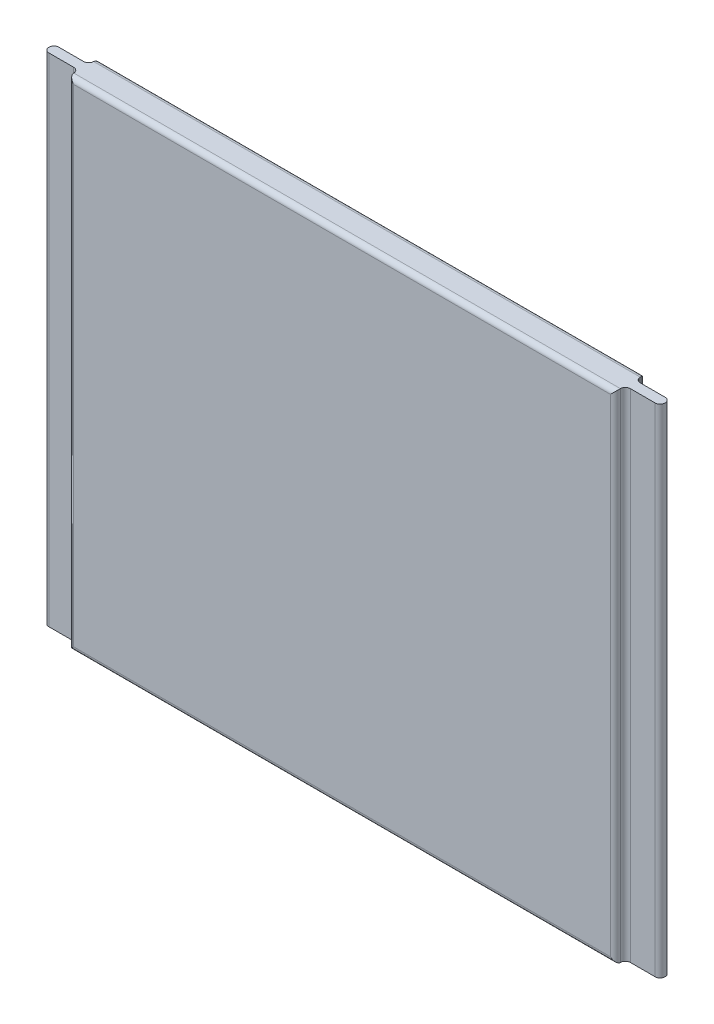
ISO-10303-21;
HEADER;
FILE_DESCRIPTION(('STEP AP214'),'2;1');
FILE_NAME('part.step','',(''),(''),'','','');
FILE_SCHEMA(('AUTOMOTIVE_DESIGN { 1 0 10303 214 1 1 1 1 }'));
ENDSEC;
DATA;
#1=APPLICATION_CONTEXT('core data for automotive mechanical design processes');
#2=APPLICATION_PROTOCOL_DEFINITION('international standard','automotive_design',2000,#1);
#3=PRODUCT_CONTEXT('',#1,'mechanical');
#4=PRODUCT('Part','Part','',(#3));
#5=PRODUCT_RELATED_PRODUCT_CATEGORY('part','',(#4));
#6=PRODUCT_DEFINITION_FORMATION('','',#4);
#7=PRODUCT_DEFINITION_CONTEXT('part definition',#1,'design');
#8=PRODUCT_DEFINITION('design','',#6,#7);
#9=PRODUCT_DEFINITION_SHAPE('','',#8);
#10=(LENGTH_UNIT() NAMED_UNIT(*) SI_UNIT(.MILLI.,.METRE.));
#11=(NAMED_UNIT(*) PLANE_ANGLE_UNIT() SI_UNIT($,.RADIAN.));
#12=(NAMED_UNIT(*) SI_UNIT($,.STERADIAN.) SOLID_ANGLE_UNIT());
#13=UNCERTAINTY_MEASURE_WITH_UNIT(LENGTH_MEASURE(1.E-05),#10,'distance_accuracy_value','');
#14=(GEOMETRIC_REPRESENTATION_CONTEXT(3) GLOBAL_UNCERTAINTY_ASSIGNED_CONTEXT((#13)) GLOBAL_UNIT_ASSIGNED_CONTEXT((#10,
#11,#12)) REPRESENTATION_CONTEXT('',''));
#15=CARTESIAN_POINT('',(0.,0.,0.));
#16=DIRECTION('',(0.,0.,1.));
#17=DIRECTION('',(1.,0.,0.));
#18=AXIS2_PLACEMENT_3D('',#15,#16,#17);
#19=CARTESIAN_POINT('',(56.,100.,2.));
#20=DIRECTION('',(0.,-1.,0.));
#21=DIRECTION('',(0.,0.,-1.));
#22=AXIS2_PLACEMENT_3D('',#19,#20,#21);
#23=CYLINDRICAL_SURFACE('',#22,1.);
#24=CARTESIAN_POINT('',(56.,0.,2.));
#25=DIRECTION('',(0.,-1.,0.));
#26=DIRECTION('',(0.,0.,-1.));
#27=AXIS2_PLACEMENT_3D('',#24,#25,#26);
#28=CIRCLE('',#27,1.);
#29=CARTESIAN_POINT('',(55.,0.,2.));
#30=VERTEX_POINT('',#29);
#31=CARTESIAN_POINT('',(56.,0.,0.999999999999996));
#32=VERTEX_POINT('',#31);
#33=EDGE_CURVE('E191',#30,#32,#28,.T.);
#34=ORIENTED_EDGE('',*,*,#33,.T.);
#35=DIRECTION('',(0.,-1.,0.));
#36=VECTOR('',#35,1.);
#37=CARTESIAN_POINT('',(56.,100.,0.999999999999996));
#38=LINE('',#37,#36);
#39=CARTESIAN_POINT('',(56.,100.,0.999999999999996));
#40=VERTEX_POINT('',#39);
#41=EDGE_CURVE('E166',#40,#32,#38,.T.);
#42=ORIENTED_EDGE('',*,*,#41,.F.);
#43=CARTESIAN_POINT('',(56.,100.,2.));
#44=DIRECTION('',(0.,-1.,0.));
#45=DIRECTION('',(0.,0.,-1.));
#46=AXIS2_PLACEMENT_3D('',#43,#44,#45);
#47=CIRCLE('',#46,1.);
#48=CARTESIAN_POINT('',(55.,100.,2.));
#49=VERTEX_POINT('',#48);
#50=EDGE_CURVE('E150',#49,#40,#47,.T.);
#51=ORIENTED_EDGE('',*,*,#50,.F.);
#52=DIRECTION('',(0.,-1.,0.));
#53=VECTOR('',#52,1.);
#54=CARTESIAN_POINT('',(55.,100.,2.));
#55=LINE('',#54,#53);
#56=EDGE_CURVE('E163',#49,#30,#55,.T.);
#57=ORIENTED_EDGE('',*,*,#56,.T.);
#58=EDGE_LOOP('',(#34,#42,#51,#57));
#59=FACE_BOUND('',#58,.T.);
#60=ADVANCED_FACE('F33',(#59),#23,.F.);
#61=CARTESIAN_POINT('',(56.,100.,0.999999999999996));
#62=DIRECTION('',(0.,0.,-1.));
#63=DIRECTION('',(-1.,0.,0.));
#64=AXIS2_PLACEMENT_3D('',#61,#62,#63);
#65=PLANE('',#64);
#66=DIRECTION('',(1.,0.,0.));
#67=VECTOR('',#66,1.);
#68=CARTESIAN_POINT('',(56.,0.,0.999999999999996));
#69=LINE('',#68,#67);
#70=CARTESIAN_POINT('',(61.,0.,1.00000000000001));
#71=VERTEX_POINT('',#70);
#72=EDGE_CURVE('E259',#32,#71,#69,.T.);
#73=ORIENTED_EDGE('',*,*,#72,.T.);
#74=DIRECTION('',(0.,-1.,0.));
#75=VECTOR('',#74,1.);
#76=CARTESIAN_POINT('',(61.,100.,1.00000000000001));
#77=LINE('',#76,#75);
#78=CARTESIAN_POINT('',(61.,100.,1.00000000000001));
#79=VERTEX_POINT('',#78);
#80=EDGE_CURVE('E213',#79,#71,#77,.T.);
#81=ORIENTED_EDGE('',*,*,#80,.F.);
#82=DIRECTION('',(1.,0.,0.));
#83=VECTOR('',#82,1.);
#84=CARTESIAN_POINT('',(56.,100.,0.999999999999996));
#85=LINE('',#84,#83);
#86=EDGE_CURVE('E168',#40,#79,#85,.T.);
#87=ORIENTED_EDGE('',*,*,#86,.F.);
#88=ORIENTED_EDGE('',*,*,#41,.T.);
#89=EDGE_LOOP('',(#73,#81,#87,#88));
#90=FACE_BOUND('',#89,.T.);
#91=ADVANCED_FACE('F281',(#90),#65,.F.);
#92=CARTESIAN_POINT('',(61.,100.,0.));
#93=DIRECTION('',(0.,-1.,0.));
#94=DIRECTION('',(0.,0.,-1.));
#95=AXIS2_PLACEMENT_3D('',#92,#93,#94);
#96=CYLINDRICAL_SURFACE('',#95,1.);
#97=CARTESIAN_POINT('',(61.,0.,0.));
#98=DIRECTION('',(0.,1.,0.));
#99=DIRECTION('',(0.,0.,-1.));
#100=AXIS2_PLACEMENT_3D('',#97,#98,#99);
#101=CIRCLE('',#100,1.);
#102=CARTESIAN_POINT('',(61.,0.,-1.));
#103=VERTEX_POINT('',#102);
#104=EDGE_CURVE('E257',#71,#103,#101,.T.);
#105=ORIENTED_EDGE('',*,*,#104,.T.);
#106=DIRECTION('',(0.,-1.,0.));
#107=VECTOR('',#106,1.);
#108=CARTESIAN_POINT('',(61.,100.,-1.));
#109=LINE('',#108,#107);
#110=CARTESIAN_POINT('',(61.,100.,-1.));
#111=VERTEX_POINT('',#110);
#112=EDGE_CURVE('E216',#111,#103,#109,.T.);
#113=ORIENTED_EDGE('',*,*,#112,.F.);
#114=CARTESIAN_POINT('',(61.,100.,0.));
#115=DIRECTION('',(0.,1.,0.));
#116=DIRECTION('',(0.,0.,-1.));
#117=AXIS2_PLACEMENT_3D('',#114,#115,#116);
#118=CIRCLE('',#117,1.);
#119=EDGE_CURVE('E275',#79,#111,#118,.T.);
#120=ORIENTED_EDGE('',*,*,#119,.F.);
#121=ORIENTED_EDGE('',*,*,#80,.T.);
#122=EDGE_LOOP('',(#105,#113,#120,#121));
#123=FACE_BOUND('',#122,.T.);
#124=ADVANCED_FACE('F285',(#123),#96,.T.);
#125=CARTESIAN_POINT('',(56.,100.,-1.));
#126=DIRECTION('',(0.,0.,1.));
#127=DIRECTION('',(1.,0.,0.));
#128=AXIS2_PLACEMENT_3D('',#125,#126,#127);
#129=PLANE('',#128);
#130=DIRECTION('',(-1.,0.,0.));
#131=VECTOR('',#130,1.);
#132=CARTESIAN_POINT('',(56.,0.,-1.));
#133=LINE('',#132,#131);
#134=CARTESIAN_POINT('',(56.,0.,-1.));
#135=VERTEX_POINT('',#134);
#136=EDGE_CURVE('E255',#103,#135,#133,.T.);
#137=ORIENTED_EDGE('',*,*,#136,.T.);
#138=DIRECTION('',(0.,-1.,0.));
#139=VECTOR('',#138,1.);
#140=CARTESIAN_POINT('',(56.,100.,-1.));
#141=LINE('',#140,#139);
#142=CARTESIAN_POINT('',(56.,100.,-1.));
#143=VERTEX_POINT('',#142);
#144=EDGE_CURVE('E219',#143,#135,#141,.T.);
#145=ORIENTED_EDGE('',*,*,#144,.F.);
#146=DIRECTION('',(-1.,0.,0.));
#147=VECTOR('',#146,1.);
#148=CARTESIAN_POINT('',(56.,100.,-1.));
#149=LINE('',#148,#147);
#150=EDGE_CURVE('E273',#111,#143,#149,.T.);
#151=ORIENTED_EDGE('',*,*,#150,.F.);
#152=ORIENTED_EDGE('',*,*,#112,.T.);
#153=EDGE_LOOP('',(#137,#145,#151,#152));
#154=FACE_BOUND('',#153,.T.);
#155=ADVANCED_FACE('F290',(#154),#129,.F.);
#156=CARTESIAN_POINT('',(56.,100.,-2.));
#157=DIRECTION('',(0.,-1.,0.));
#158=DIRECTION('',(0.,0.,-1.));
#159=AXIS2_PLACEMENT_3D('',#156,#157,#158);
#160=CYLINDRICAL_SURFACE('',#159,1.);
#161=CARTESIAN_POINT('',(56.,0.,-2.));
#162=DIRECTION('',(0.,-1.,0.));
#163=DIRECTION('',(0.,0.,1.));
#164=AXIS2_PLACEMENT_3D('',#161,#162,#163);
#165=CIRCLE('',#164,1.);
#166=CARTESIAN_POINT('',(55.,0.,-2.));
#167=VERTEX_POINT('',#166);
#168=EDGE_CURVE('E252',#135,#167,#165,.T.);
#169=ORIENTED_EDGE('',*,*,#168,.T.);
#170=DIRECTION('',(0.,-1.,0.));
#171=VECTOR('',#170,1.);
#172=CARTESIAN_POINT('',(55.,100.,-2.));
#173=LINE('',#172,#171);
#174=CARTESIAN_POINT('',(55.,100.,-2.));
#175=VERTEX_POINT('',#174);
#176=EDGE_CURVE('E222',#175,#167,#173,.T.);
#177=ORIENTED_EDGE('',*,*,#176,.F.);
#178=CARTESIAN_POINT('',(56.,100.,-2.));
#179=DIRECTION('',(0.,-1.,0.));
#180=DIRECTION('',(0.,0.,1.));
#181=AXIS2_PLACEMENT_3D('',#178,#179,#180);
#182=CIRCLE('',#181,1.);
#183=EDGE_CURVE('E271',#143,#175,#182,.T.);
#184=ORIENTED_EDGE('',*,*,#183,.F.);
#185=ORIENTED_EDGE('',*,*,#144,.T.);
#186=EDGE_LOOP('',(#169,#177,#184,#185));
#187=FACE_BOUND('',#186,.T.);
#188=ADVANCED_FACE('F296',(#187),#160,.F.);
#189=CARTESIAN_POINT('',(-55.,100.,-3.));
#190=DIRECTION('',(0.,0.,1.));
#191=DIRECTION('',(1.,0.,0.));
#192=AXIS2_PLACEMENT_3D('',#189,#190,#191);
#193=PLANE('',#192);
#194=DIRECTION('',(-1.,0.,0.));
#195=VECTOR('',#194,1.);
#196=CARTESIAN_POINT('',(55.,99.,-3.00000000000001));
#197=LINE('',#196,#195);
#198=CARTESIAN_POINT('',(-54.,99.,-3.));
#199=VERTEX_POINT('',#198);
#200=CARTESIAN_POINT('',(54.,99.,-3.00000000000001));
#201=VERTEX_POINT('',#200);
#202=EDGE_CURVE('E207',#199,#201,#197,.F.);
#203=ORIENTED_EDGE('',*,*,#202,.T.);
#204=DIRECTION('',(0.,-1.,0.));
#205=VECTOR('',#204,1.);
#206=CARTESIAN_POINT('',(54.,100.,-3.00000000000001));
#207=LINE('',#206,#205);
#208=CARTESIAN_POINT('',(54.,1.,-3.00000000000001));
#209=VERTEX_POINT('',#208);
#210=EDGE_CURVE('E158',#201,#209,#207,.T.);
#211=ORIENTED_EDGE('',*,*,#210,.T.);
#212=DIRECTION('',(-1.,0.,0.));
#213=VECTOR('',#212,1.);
#214=CARTESIAN_POINT('',(-55.,1.,-3.));
#215=LINE('',#214,#213);
#216=CARTESIAN_POINT('',(-54.,1.,-3.));
#217=VERTEX_POINT('',#216);
#218=EDGE_CURVE('E175',#209,#217,#215,.T.);
#219=ORIENTED_EDGE('',*,*,#218,.T.);
#220=DIRECTION('',(0.,-1.,0.));
#221=VECTOR('',#220,1.);
#222=CARTESIAN_POINT('',(-54.,100.,-3.));
#223=LINE('',#222,#221);
#224=EDGE_CURVE('E209',#217,#199,#223,.F.);
#225=ORIENTED_EDGE('',*,*,#224,.T.);
#226=EDGE_LOOP('',(#203,#211,#219,#225));
#227=FACE_BOUND('',#226,.T.);
#228=ADVANCED_FACE('F310',(#227),#193,.F.);
#229=CARTESIAN_POINT('',(-56.,100.,-1.99999999999999));
#230=DIRECTION('',(0.,-1.,0.));
#231=DIRECTION('',(0.,0.,-1.));
#232=AXIS2_PLACEMENT_3D('',#229,#230,#231);
#233=CYLINDRICAL_SURFACE('',#232,1.);
#234=CARTESIAN_POINT('',(-56.,0.,-1.99999999999999));
#235=DIRECTION('',(0.,-1.,0.));
#236=DIRECTION('',(0.,0.,-1.));
#237=AXIS2_PLACEMENT_3D('',#234,#235,#236);
#238=CIRCLE('',#237,1.);
#239=CARTESIAN_POINT('',(-55.,0.,-1.99999999999999));
#240=VERTEX_POINT('',#239);
#241=CARTESIAN_POINT('',(-56.,0.,-0.99999999999999));
#242=VERTEX_POINT('',#241);
#243=EDGE_CURVE('E250',#240,#242,#238,.T.);
#244=ORIENTED_EDGE('',*,*,#243,.T.);
#245=DIRECTION('',(0.,-1.,0.));
#246=VECTOR('',#245,1.);
#247=CARTESIAN_POINT('',(-56.,100.,-0.99999999999999));
#248=LINE('',#247,#246);
#249=CARTESIAN_POINT('',(-56.,100.,-0.99999999999999));
#250=VERTEX_POINT('',#249);
#251=EDGE_CURVE('E227',#250,#242,#248,.T.);
#252=ORIENTED_EDGE('',*,*,#251,.F.);
#253=CARTESIAN_POINT('',(-56.,100.,-1.99999999999999));
#254=DIRECTION('',(0.,-1.,0.));
#255=DIRECTION('',(0.,0.,-1.));
#256=AXIS2_PLACEMENT_3D('',#253,#254,#255);
#257=CIRCLE('',#256,1.);
#258=CARTESIAN_POINT('',(-55.,100.,-1.99999999999999));
#259=VERTEX_POINT('',#258);
#260=EDGE_CURVE('E269',#259,#250,#257,.T.);
#261=ORIENTED_EDGE('',*,*,#260,.F.);
#262=DIRECTION('',(0.,-1.,0.));
#263=VECTOR('',#262,1.);
#264=CARTESIAN_POINT('',(-55.,100.,-1.99999999999999));
#265=LINE('',#264,#263);
#266=EDGE_CURVE('E225',#259,#240,#265,.T.);
#267=ORIENTED_EDGE('',*,*,#266,.T.);
#268=EDGE_LOOP('',(#244,#252,#261,#267));
#269=FACE_BOUND('',#268,.T.);
#270=ADVANCED_FACE('F320',(#269),#233,.F.);
#271=CARTESIAN_POINT('',(-56.,100.,-0.99999999999999));
#272=DIRECTION('',(0.,0.,1.));
#273=DIRECTION('',(1.,0.,0.));
#274=AXIS2_PLACEMENT_3D('',#271,#272,#273);
#275=PLANE('',#274);
#276=DIRECTION('',(-1.,0.,0.));
#277=VECTOR('',#276,1.);
#278=CARTESIAN_POINT('',(-56.,0.,-0.99999999999999));
#279=LINE('',#278,#277);
#280=CARTESIAN_POINT('',(-61.,0.,-0.999999999999989));
#281=VERTEX_POINT('',#280);
#282=EDGE_CURVE('E248',#242,#281,#279,.T.);
#283=ORIENTED_EDGE('',*,*,#282,.T.);
#284=DIRECTION('',(0.,-1.,0.));
#285=VECTOR('',#284,1.);
#286=CARTESIAN_POINT('',(-61.,100.,-0.999999999999989));
#287=LINE('',#286,#285);
#288=CARTESIAN_POINT('',(-61.,100.,-0.999999999999989));
#289=VERTEX_POINT('',#288);
#290=EDGE_CURVE('E230',#289,#281,#287,.T.);
#291=ORIENTED_EDGE('',*,*,#290,.F.);
#292=DIRECTION('',(-1.,0.,0.));
#293=VECTOR('',#292,1.);
#294=CARTESIAN_POINT('',(-56.,100.,-0.99999999999999));
#295=LINE('',#294,#293);
#296=EDGE_CURVE('E267',#250,#289,#295,.T.);
#297=ORIENTED_EDGE('',*,*,#296,.F.);
#298=ORIENTED_EDGE('',*,*,#251,.T.);
#299=EDGE_LOOP('',(#283,#291,#297,#298));
#300=FACE_BOUND('',#299,.T.);
#301=ADVANCED_FACE('F329',(#300),#275,.F.);
#302=CARTESIAN_POINT('',(-61.,100.,0.));
#303=DIRECTION('',(0.,-1.,0.));
#304=DIRECTION('',(0.,0.,-1.));
#305=AXIS2_PLACEMENT_3D('',#302,#303,#304);
#306=CYLINDRICAL_SURFACE('',#305,1.);
#307=CARTESIAN_POINT('',(-61.,0.,0.));
#308=DIRECTION('',(0.,1.,0.));
#309=DIRECTION('',(0.,0.,1.));
#310=AXIS2_PLACEMENT_3D('',#307,#308,#309);
#311=CIRCLE('',#310,1.);
#312=CARTESIAN_POINT('',(-61.,0.,1.00000000000001));
#313=VERTEX_POINT('',#312);
#314=EDGE_CURVE('E246',#281,#313,#311,.T.);
#315=ORIENTED_EDGE('',*,*,#314,.T.);
#316=DIRECTION('',(0.,-1.,0.));
#317=VECTOR('',#316,1.);
#318=CARTESIAN_POINT('',(-61.,100.,1.00000000000001));
#319=LINE('',#318,#317);
#320=CARTESIAN_POINT('',(-61.,100.,1.00000000000001));
#321=VERTEX_POINT('',#320);
#322=EDGE_CURVE('E233',#321,#313,#319,.T.);
#323=ORIENTED_EDGE('',*,*,#322,.F.);
#324=CARTESIAN_POINT('',(-61.,100.,0.));
#325=DIRECTION('',(0.,1.,0.));
#326=DIRECTION('',(0.,0.,1.));
#327=AXIS2_PLACEMENT_3D('',#324,#325,#326);
#328=CIRCLE('',#327,1.);
#329=EDGE_CURVE('E265',#289,#321,#328,.T.);
#330=ORIENTED_EDGE('',*,*,#329,.F.);
#331=ORIENTED_EDGE('',*,*,#290,.T.);
#332=EDGE_LOOP('',(#315,#323,#330,#331));
#333=FACE_BOUND('',#332,.T.);
#334=ADVANCED_FACE('F333',(#333),#306,.T.);
#335=CARTESIAN_POINT('',(-56.,100.,1.00000000000001));
#336=DIRECTION('',(0.,0.,-1.));
#337=DIRECTION('',(-1.,0.,0.));
#338=AXIS2_PLACEMENT_3D('',#335,#336,#337);
#339=PLANE('',#338);
#340=DIRECTION('',(1.,0.,0.));
#341=VECTOR('',#340,1.);
#342=CARTESIAN_POINT('',(-56.,0.,1.00000000000001));
#343=LINE('',#342,#341);
#344=CARTESIAN_POINT('',(-56.,0.,1.00000000000001));
#345=VERTEX_POINT('',#344);
#346=EDGE_CURVE('E244',#313,#345,#343,.T.);
#347=ORIENTED_EDGE('',*,*,#346,.T.);
#348=DIRECTION('',(0.,-1.,0.));
#349=VECTOR('',#348,1.);
#350=CARTESIAN_POINT('',(-56.,100.,1.00000000000001));
#351=LINE('',#350,#349);
#352=CARTESIAN_POINT('',(-56.,100.,1.00000000000001));
#353=VERTEX_POINT('',#352);
#354=EDGE_CURVE('E236',#353,#345,#351,.T.);
#355=ORIENTED_EDGE('',*,*,#354,.F.);
#356=DIRECTION('',(1.,0.,0.));
#357=VECTOR('',#356,1.);
#358=CARTESIAN_POINT('',(-56.,100.,1.00000000000001));
#359=LINE('',#358,#357);
#360=EDGE_CURVE('E263',#321,#353,#359,.T.);
#361=ORIENTED_EDGE('',*,*,#360,.F.);
#362=ORIENTED_EDGE('',*,*,#322,.T.);
#363=EDGE_LOOP('',(#347,#355,#361,#362));
#364=FACE_BOUND('',#363,.T.);
#365=ADVANCED_FACE('F338',(#364),#339,.F.);
#366=CARTESIAN_POINT('',(-56.,100.,2.00000000000001));
#367=DIRECTION('',(0.,-1.,0.));
#368=DIRECTION('',(0.,0.,-1.));
#369=AXIS2_PLACEMENT_3D('',#366,#367,#368);
#370=CYLINDRICAL_SURFACE('',#369,1.);
#371=CARTESIAN_POINT('',(-56.,0.,2.00000000000001));
#372=DIRECTION('',(0.,-1.,0.));
#373=DIRECTION('',(0.,0.,1.));
#374=AXIS2_PLACEMENT_3D('',#371,#372,#373);
#375=CIRCLE('',#374,1.);
#376=CARTESIAN_POINT('',(-55.,0.,2.00000000000001));
#377=VERTEX_POINT('',#376);
#378=EDGE_CURVE('E169',#345,#377,#375,.T.);
#379=ORIENTED_EDGE('',*,*,#378,.T.);
#380=DIRECTION('',(0.,-1.,0.));
#381=VECTOR('',#380,1.);
#382=CARTESIAN_POINT('',(-55.,100.,2.00000000000001));
#383=LINE('',#382,#381);
#384=CARTESIAN_POINT('',(-55.,100.,2.00000000000001));
#385=VERTEX_POINT('',#384);
#386=EDGE_CURVE('E239',#385,#377,#383,.T.);
#387=ORIENTED_EDGE('',*,*,#386,.F.);
#388=CARTESIAN_POINT('',(-56.,100.,2.00000000000001));
#389=DIRECTION('',(0.,-1.,0.));
#390=DIRECTION('',(0.,0.,1.));
#391=AXIS2_PLACEMENT_3D('',#388,#389,#390);
#392=CIRCLE('',#391,1.);
#393=EDGE_CURVE('E153',#353,#385,#392,.T.);
#394=ORIENTED_EDGE('',*,*,#393,.F.);
#395=ORIENTED_EDGE('',*,*,#354,.T.);
#396=EDGE_LOOP('',(#379,#387,#394,#395));
#397=FACE_BOUND('',#396,.T.);
#398=ADVANCED_FACE('F341',(#397),#370,.F.);
#399=CARTESIAN_POINT('',(-55.,100.,3.00000000000001));
#400=DIRECTION('',(0.,0.,-1.));
#401=DIRECTION('',(-1.,0.,0.));
#402=AXIS2_PLACEMENT_3D('',#399,#400,#401);
#403=PLANE('',#402);
#404=DIRECTION('',(1.,0.,0.));
#405=VECTOR('',#404,1.);
#406=CARTESIAN_POINT('',(-55.,99.,3.00000000000001));
#407=LINE('',#406,#405);
#408=CARTESIAN_POINT('',(54.,99.,3.));
#409=VERTEX_POINT('',#408);
#410=CARTESIAN_POINT('',(-54.,99.,3.00000000000001));
#411=VERTEX_POINT('',#410);
#412=EDGE_CURVE('E42',#409,#411,#407,.F.);
#413=ORIENTED_EDGE('',*,*,#412,.T.);
#414=DIRECTION('',(0.,-1.,0.));
#415=VECTOR('',#414,1.);
#416=CARTESIAN_POINT('',(-54.,100.,3.00000000000001));
#417=LINE('',#416,#415);
#418=CARTESIAN_POINT('',(-54.,1.,3.00000000000001));
#419=VERTEX_POINT('',#418);
#420=EDGE_CURVE('E11',#411,#419,#417,.T.);
#421=ORIENTED_EDGE('',*,*,#420,.T.);
#422=DIRECTION('',(1.,0.,0.));
#423=VECTOR('',#422,1.);
#424=CARTESIAN_POINT('',(-55.,1.,3.00000000000001));
#425=LINE('',#424,#423);
#426=CARTESIAN_POINT('',(54.,1.,3.));
#427=VERTEX_POINT('',#426);
#428=EDGE_CURVE('E198',#419,#427,#425,.T.);
#429=ORIENTED_EDGE('',*,*,#428,.T.);
#430=DIRECTION('',(0.,-1.,0.));
#431=VECTOR('',#430,1.);
#432=CARTESIAN_POINT('',(54.,100.,3.));
#433=LINE('',#432,#431);
#434=EDGE_CURVE('E53',#427,#409,#433,.F.);
#435=ORIENTED_EDGE('',*,*,#434,.T.);
#436=EDGE_LOOP('',(#413,#421,#429,#435));
#437=FACE_BOUND('',#436,.T.);
#438=ADVANCED_FACE('F347',(#437),#403,.F.);
#439=CARTESIAN_POINT('',(-56.,100.,2.00000000000001));
#440=DIRECTION('',(0.,1.,0.));
#441=DIRECTION('',(0.,0.,1.));
#442=AXIS2_PLACEMENT_3D('',#439,#440,#441);
#443=PLANE('',#442);
#444=ORIENTED_EDGE('',*,*,#183,.T.);
#445=DIRECTION('',(-1.,0.,0.));
#446=VECTOR('',#445,1.);
#447=CARTESIAN_POINT('',(-55.,100.,-2.));
#448=LINE('',#447,#446);
#449=EDGE_CURVE('E157',#175,#259,#448,.T.);
#450=ORIENTED_EDGE('',*,*,#449,.T.);
#451=ORIENTED_EDGE('',*,*,#260,.T.);
#452=ORIENTED_EDGE('',*,*,#296,.T.);
#453=ORIENTED_EDGE('',*,*,#329,.T.);
#454=ORIENTED_EDGE('',*,*,#360,.T.);
#455=ORIENTED_EDGE('',*,*,#393,.T.);
#456=DIRECTION('',(1.,0.,0.));
#457=VECTOR('',#456,1.);
#458=CARTESIAN_POINT('',(55.,100.,2.));
#459=LINE('',#458,#457);
#460=EDGE_CURVE('E146',#385,#49,#459,.T.);
#461=ORIENTED_EDGE('',*,*,#460,.T.);
#462=ORIENTED_EDGE('',*,*,#50,.T.);
#463=ORIENTED_EDGE('',*,*,#86,.T.);
#464=ORIENTED_EDGE('',*,*,#119,.T.);
#465=ORIENTED_EDGE('',*,*,#150,.T.);
#466=EDGE_LOOP('',(#444,#450,#451,#452,#453,#454,#455,#461,#462,#463,#464,#465));
#467=FACE_BOUND('',#466,.T.);
#468=ADVANCED_FACE('F149',(#467),#443,.T.);
#469=CARTESIAN_POINT('',(-56.,0.,2.00000000000001));
#470=DIRECTION('',(0.,1.,0.));
#471=DIRECTION('',(0.,0.,1.));
#472=AXIS2_PLACEMENT_3D('',#469,#470,#471);
#473=PLANE('',#472);
#474=ORIENTED_EDGE('',*,*,#243,.F.);
#475=DIRECTION('',(-1.,0.,0.));
#476=VECTOR('',#475,1.);
#477=CARTESIAN_POINT('',(-56.,0.,-2.));
#478=LINE('',#477,#476);
#479=EDGE_CURVE('E200',#240,#167,#478,.F.);
#480=ORIENTED_EDGE('',*,*,#479,.T.);
#481=ORIENTED_EDGE('',*,*,#168,.F.);
#482=ORIENTED_EDGE('',*,*,#136,.F.);
#483=ORIENTED_EDGE('',*,*,#104,.F.);
#484=ORIENTED_EDGE('',*,*,#72,.F.);
#485=ORIENTED_EDGE('',*,*,#33,.F.);
#486=DIRECTION('',(1.,0.,0.));
#487=VECTOR('',#486,1.);
#488=CARTESIAN_POINT('',(-56.,0.,2.00000000000001));
#489=LINE('',#488,#487);
#490=EDGE_CURVE('E202',#30,#377,#489,.F.);
#491=ORIENTED_EDGE('',*,*,#490,.T.);
#492=ORIENTED_EDGE('',*,*,#378,.F.);
#493=ORIENTED_EDGE('',*,*,#346,.F.);
#494=ORIENTED_EDGE('',*,*,#314,.F.);
#495=ORIENTED_EDGE('',*,*,#282,.F.);
#496=EDGE_LOOP('',(#474,#480,#481,#482,#483,#484,#485,#491,#492,#493,#494,#495));
#497=FACE_BOUND('',#496,.T.);
#498=ADVANCED_FACE('F324',(#497),#473,.F.);
#499=CARTESIAN_POINT('',(-54.,100.,-2.));
#500=DIRECTION('',(0.,-1.,0.));
#501=DIRECTION('',(0.,0.,-1.));
#502=AXIS2_PLACEMENT_3D('',#499,#500,#501);
#503=CYLINDRICAL_SURFACE('',#502,1.);
#504=CARTESIAN_POINT('',(-54.,1.,-2.));
#505=DIRECTION('',(-0.707106781186547,0.707106781186547,0.));
#506=DIRECTION('',(-0.707106781186547,-0.707106781186547,0.));
#507=AXIS2_PLACEMENT_3D('',#504,#505,#506);
#508=ELLIPSE('',#507,1.41421356237309,1.);
#509=EDGE_CURVE('E192',#240,#217,#508,.F.);
#510=ORIENTED_EDGE('',*,*,#509,.F.);
#511=ORIENTED_EDGE('',*,*,#266,.F.);
#512=CARTESIAN_POINT('',(-54.,99.,-2.));
#513=DIRECTION('',(-0.707106781186547,-0.707106781186547,0.));
#514=DIRECTION('',(0.707106781186547,-0.707106781186547,0.));
#515=AXIS2_PLACEMENT_3D('',#512,#513,#514);
#516=ELLIPSE('',#515,1.41421356237309,1.);
#517=EDGE_CURVE('E188',#199,#259,#516,.F.);
#518=ORIENTED_EDGE('',*,*,#517,.F.);
#519=ORIENTED_EDGE('',*,*,#224,.F.);
#520=EDGE_LOOP('',(#510,#511,#518,#519));
#521=FACE_BOUND('',#520,.T.);
#522=ADVANCED_FACE('F317',(#521),#503,.T.);
#523=CARTESIAN_POINT('',(-56.,99.,-2.));
#524=DIRECTION('',(1.,0.,0.));
#525=DIRECTION('',(0.,0.,-1.));
#526=AXIS2_PLACEMENT_3D('',#523,#524,#525);
#527=CYLINDRICAL_SURFACE('',#526,1.);
#528=ORIENTED_EDGE('',*,*,#517,.T.);
#529=ORIENTED_EDGE('',*,*,#449,.F.);
#530=CARTESIAN_POINT('',(54.,99.,-2.00000000000001));
#531=DIRECTION('',(0.707106781186547,-0.707106781186547,0.));
#532=DIRECTION('',(0.707106781186547,0.707106781186547,0.));
#533=AXIS2_PLACEMENT_3D('',#530,#531,#532);
#534=ELLIPSE('',#533,1.41421356237309,1.);
#535=EDGE_CURVE('E179',#201,#175,#534,.T.);
#536=ORIENTED_EDGE('',*,*,#535,.F.);
#537=ORIENTED_EDGE('',*,*,#202,.F.);
#538=EDGE_LOOP('',(#528,#529,#536,#537));
#539=FACE_BOUND('',#538,.T.);
#540=ADVANCED_FACE('F314',(#539),#527,.T.);
#541=CARTESIAN_POINT('',(-55.,1.,-2.));
#542=DIRECTION('',(-1.,0.,0.));
#543=DIRECTION('',(0.,0.,1.));
#544=AXIS2_PLACEMENT_3D('',#541,#542,#543);
#545=CYLINDRICAL_SURFACE('',#544,1.);
#546=ORIENTED_EDGE('',*,*,#509,.T.);
#547=ORIENTED_EDGE('',*,*,#218,.F.);
#548=CARTESIAN_POINT('',(54.,1.,-2.00000000000001));
#549=DIRECTION('',(-0.707106781186547,-0.707106781186547,0.));
#550=DIRECTION('',(-0.707106781186547,0.707106781186547,0.));
#551=AXIS2_PLACEMENT_3D('',#548,#549,#550);
#552=ELLIPSE('',#551,1.41421356237309,1.);
#553=EDGE_CURVE('E178',#167,#209,#552,.F.);
#554=ORIENTED_EDGE('',*,*,#553,.F.);
#555=ORIENTED_EDGE('',*,*,#479,.F.);
#556=EDGE_LOOP('',(#546,#547,#554,#555));
#557=FACE_BOUND('',#556,.T.);
#558=ADVANCED_FACE('F306',(#557),#545,.T.);
#559=CARTESIAN_POINT('',(54.,100.,-2.00000000000001));
#560=DIRECTION('',(0.,-1.,0.));
#561=DIRECTION('',(0.,0.,-1.));
#562=AXIS2_PLACEMENT_3D('',#559,#560,#561);
#563=CYLINDRICAL_SURFACE('',#562,1.);
#564=ORIENTED_EDGE('',*,*,#535,.T.);
#565=ORIENTED_EDGE('',*,*,#176,.T.);
#566=ORIENTED_EDGE('',*,*,#553,.T.);
#567=ORIENTED_EDGE('',*,*,#210,.F.);
#568=EDGE_LOOP('',(#564,#565,#566,#567));
#569=FACE_BOUND('',#568,.T.);
#570=ADVANCED_FACE('F300',(#569),#563,.T.);
#571=CARTESIAN_POINT('',(54.,100.,2.));
#572=DIRECTION('',(0.,-1.,0.));
#573=DIRECTION('',(0.,0.,-1.));
#574=AXIS2_PLACEMENT_3D('',#571,#572,#573);
#575=CYLINDRICAL_SURFACE('',#574,1.);
#576=CARTESIAN_POINT('',(54.,1.,2.));
#577=DIRECTION('',(0.707106781186547,0.707106781186547,0.));
#578=DIRECTION('',(0.707106781186547,-0.707106781186547,0.));
#579=AXIS2_PLACEMENT_3D('',#576,#577,#578);
#580=ELLIPSE('',#579,1.41421356237309,1.);
#581=EDGE_CURVE('E173',#30,#427,#580,.F.);
#582=ORIENTED_EDGE('',*,*,#581,.F.);
#583=ORIENTED_EDGE('',*,*,#56,.F.);
#584=CARTESIAN_POINT('',(54.,99.,2.));
#585=DIRECTION('',(0.707106781186547,-0.707106781186547,0.));
#586=DIRECTION('',(-0.707106781186547,-0.707106781186547,0.));
#587=AXIS2_PLACEMENT_3D('',#584,#585,#586);
#588=ELLIPSE('',#587,1.41421356237309,1.);
#589=EDGE_CURVE('E37',#409,#49,#588,.F.);
#590=ORIENTED_EDGE('',*,*,#589,.F.);
#591=ORIENTED_EDGE('',*,*,#434,.F.);
#592=EDGE_LOOP('',(#582,#583,#590,#591));
#593=FACE_BOUND('',#592,.T.);
#594=ADVANCED_FACE('F35',(#593),#575,.T.);
#595=CARTESIAN_POINT('',(-56.,99.,2.00000000000001));
#596=DIRECTION('',(-1.,0.,0.));
#597=DIRECTION('',(0.,0.,1.));
#598=AXIS2_PLACEMENT_3D('',#595,#596,#597);
#599=CYLINDRICAL_SURFACE('',#598,1.);
#600=ORIENTED_EDGE('',*,*,#589,.T.);
#601=ORIENTED_EDGE('',*,*,#460,.F.);
#602=CARTESIAN_POINT('',(-54.,99.,2.00000000000001));
#603=DIRECTION('',(-0.707106781186547,-0.707106781186547,0.));
#604=DIRECTION('',(-0.707106781186547,0.707106781186547,0.));
#605=AXIS2_PLACEMENT_3D('',#602,#603,#604);
#606=ELLIPSE('',#605,1.41421356237309,1.);
#607=EDGE_CURVE('E181',#411,#385,#606,.T.);
#608=ORIENTED_EDGE('',*,*,#607,.F.);
#609=ORIENTED_EDGE('',*,*,#412,.F.);
#610=EDGE_LOOP('',(#600,#601,#608,#609));
#611=FACE_BOUND('',#610,.T.);
#612=ADVANCED_FACE('F177',(#611),#599,.T.);
#613=CARTESIAN_POINT('',(-55.,1.,2.00000000000001));
#614=DIRECTION('',(1.,0.,0.));
#615=DIRECTION('',(0.,0.,-1.));
#616=AXIS2_PLACEMENT_3D('',#613,#614,#615);
#617=CYLINDRICAL_SURFACE('',#616,1.);
#618=ORIENTED_EDGE('',*,*,#581,.T.);
#619=ORIENTED_EDGE('',*,*,#428,.F.);
#620=CARTESIAN_POINT('',(-54.,1.,2.00000000000001));
#621=DIRECTION('',(0.707106781186547,-0.707106781186547,0.));
#622=DIRECTION('',(0.707106781186547,0.707106781186547,0.));
#623=AXIS2_PLACEMENT_3D('',#620,#621,#622);
#624=ELLIPSE('',#623,1.41421356237309,1.);
#625=EDGE_CURVE('E184',#377,#419,#624,.F.);
#626=ORIENTED_EDGE('',*,*,#625,.F.);
#627=ORIENTED_EDGE('',*,*,#490,.F.);
#628=EDGE_LOOP('',(#618,#619,#626,#627));
#629=FACE_BOUND('',#628,.T.);
#630=ADVANCED_FACE('F346',(#629),#617,.T.);
#631=CARTESIAN_POINT('',(-54.,100.,2.00000000000001));
#632=DIRECTION('',(0.,-1.,0.));
#633=DIRECTION('',(0.,0.,-1.));
#634=AXIS2_PLACEMENT_3D('',#631,#632,#633);
#635=CYLINDRICAL_SURFACE('',#634,1.);
#636=ORIENTED_EDGE('',*,*,#607,.T.);
#637=ORIENTED_EDGE('',*,*,#386,.T.);
#638=ORIENTED_EDGE('',*,*,#625,.T.);
#639=ORIENTED_EDGE('',*,*,#420,.F.);
#640=EDGE_LOOP('',(#636,#637,#638,#639));
#641=FACE_BOUND('',#640,.T.);
#642=ADVANCED_FACE('F344',(#641),#635,.T.);
#643=CLOSED_SHELL('',(#60,#91,#124,#155,#188,#228,#270,#301,#334,#365,#398,#438,#468,#498,#522,
#540,#558,#570,#594,#612,#630,#642));
#644=MANIFOLD_SOLID_BREP('B2',#643);
#645=ADVANCED_BREP_SHAPE_REPRESENTATION('',(#18,#644),#14);
#646=SHAPE_DEFINITION_REPRESENTATION(#9,#645);
ENDSEC;
END-ISO-10303-21;
